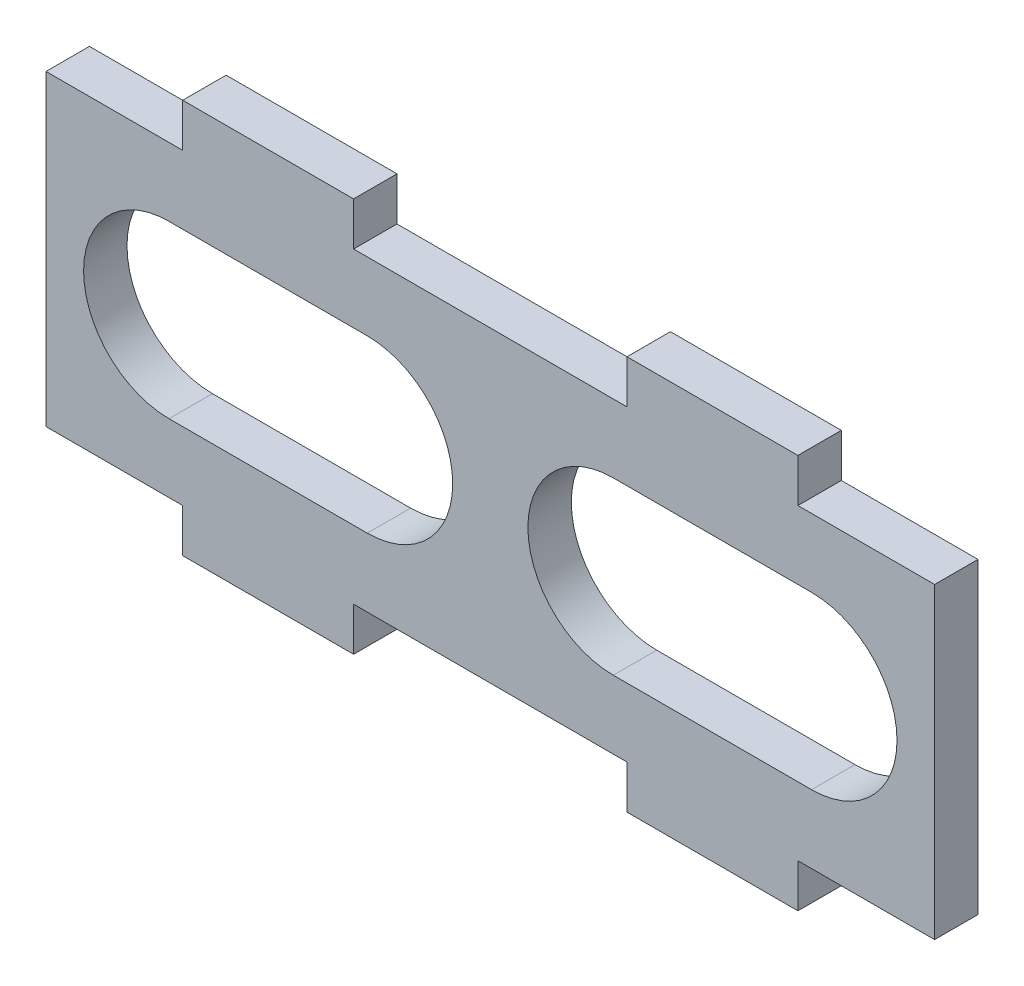
ISO-10303-21;
HEADER;
FILE_DESCRIPTION(('STEP AP214'),'2;1');
FILE_NAME('part.step','',(''),(''),'','','');
FILE_SCHEMA(('AUTOMOTIVE_DESIGN { 1 0 10303 214 1 1 1 1 }'));
ENDSEC;
DATA;
#1=APPLICATION_CONTEXT('core data for automotive mechanical design processes');
#2=APPLICATION_PROTOCOL_DEFINITION('international standard','automotive_design',2000,#1);
#3=PRODUCT_CONTEXT('',#1,'mechanical');
#4=PRODUCT('Part','Part','',(#3));
#5=PRODUCT_RELATED_PRODUCT_CATEGORY('part','',(#4));
#6=PRODUCT_DEFINITION_FORMATION('','',#4);
#7=PRODUCT_DEFINITION_CONTEXT('part definition',#1,'design');
#8=PRODUCT_DEFINITION('design','',#6,#7);
#9=PRODUCT_DEFINITION_SHAPE('','',#8);
#10=(LENGTH_UNIT() NAMED_UNIT(*) SI_UNIT(.MILLI.,.METRE.));
#11=(NAMED_UNIT(*) PLANE_ANGLE_UNIT() SI_UNIT($,.RADIAN.));
#12=(NAMED_UNIT(*) SI_UNIT($,.STERADIAN.) SOLID_ANGLE_UNIT());
#13=UNCERTAINTY_MEASURE_WITH_UNIT(LENGTH_MEASURE(1.E-05),#10,'distance_accuracy_value','');
#14=(GEOMETRIC_REPRESENTATION_CONTEXT(3) GLOBAL_UNCERTAINTY_ASSIGNED_CONTEXT((#13)) GLOBAL_UNIT_ASSIGNED_CONTEXT((#10,
#11,#12)) REPRESENTATION_CONTEXT('',''));
#15=CARTESIAN_POINT('',(0.,0.,0.));
#16=DIRECTION('',(0.,0.,1.));
#17=DIRECTION('',(1.,0.,0.));
#18=AXIS2_PLACEMENT_3D('',#15,#16,#17);
#19=CARTESIAN_POINT('',(-65.,0.,6.35));
#20=DIRECTION('',(0.,1.,0.));
#21=DIRECTION('',(0.,0.,1.));
#22=AXIS2_PLACEMENT_3D('',#19,#20,#21);
#23=PLANE('',#22);
#24=DIRECTION('',(1.,0.,0.));
#25=VECTOR('',#24,1.);
#26=CARTESIAN_POINT('',(-65.,0.,0.));
#27=LINE('',#26,#25);
#28=CARTESIAN_POINT('',(-20.,0.,0.));
#29=VERTEX_POINT('',#28);
#30=CARTESIAN_POINT('',(20.,0.,0.));
#31=VERTEX_POINT('',#30);
#32=EDGE_CURVE('E422',#29,#31,#27,.T.);
#33=ORIENTED_EDGE('',*,*,#32,.T.);
#34=DIRECTION('',(0.,0.,1.));
#35=VECTOR('',#34,1.);
#36=CARTESIAN_POINT('',(20.,0.,-25.7938461653163));
#37=LINE('',#36,#35);
#38=CARTESIAN_POINT('',(20.,0.,6.35));
#39=VERTEX_POINT('',#38);
#40=EDGE_CURVE('E55',#31,#39,#37,.T.);
#41=ORIENTED_EDGE('',*,*,#40,.T.);
#42=DIRECTION('',(1.,0.,0.));
#43=VECTOR('',#42,1.);
#44=CARTESIAN_POINT('',(-65.,0.,6.35));
#45=LINE('',#44,#43);
#46=CARTESIAN_POINT('',(-20.,0.,6.35));
#47=VERTEX_POINT('',#46);
#48=EDGE_CURVE('E407',#47,#39,#45,.T.);
#49=ORIENTED_EDGE('',*,*,#48,.F.);
#50=DIRECTION('',(0.,0.,1.));
#51=VECTOR('',#50,1.);
#52=CARTESIAN_POINT('',(-20.,0.,-25.7938461653163));
#53=LINE('',#52,#51);
#54=EDGE_CURVE('E302',#29,#47,#53,.T.);
#55=ORIENTED_EDGE('',*,*,#54,.F.);
#56=EDGE_LOOP('',(#33,#41,#49,#55));
#57=FACE_BOUND('',#56,.T.);
#58=ADVANCED_FACE('F32',(#57),#23,.F.);
#59=CARTESIAN_POINT('',(-65.,45.,6.35));
#60=DIRECTION('',(0.,-1.,0.));
#61=DIRECTION('',(1.,0.,0.));
#62=AXIS2_PLACEMENT_3D('',#59,#60,#61);
#63=PLANE('',#62);
#64=DIRECTION('',(-1.,0.,0.));
#65=VECTOR('',#64,1.);
#66=CARTESIAN_POINT('',(-65.,45.,6.35));
#67=LINE('',#66,#65);
#68=CARTESIAN_POINT('',(20.,45.,6.35));
#69=VERTEX_POINT('',#68);
#70=CARTESIAN_POINT('',(-20.,45.,6.35));
#71=VERTEX_POINT('',#70);
#72=EDGE_CURVE('E414',#69,#71,#67,.T.);
#73=ORIENTED_EDGE('',*,*,#72,.F.);
#74=DIRECTION('',(0.,0.,1.));
#75=VECTOR('',#74,1.);
#76=CARTESIAN_POINT('',(20.,45.,-25.7938461653163));
#77=LINE('',#76,#75);
#78=CARTESIAN_POINT('',(20.,45.,0.));
#79=VERTEX_POINT('',#78);
#80=EDGE_CURVE('E276',#79,#69,#77,.T.);
#81=ORIENTED_EDGE('',*,*,#80,.F.);
#82=DIRECTION('',(-1.,0.,0.));
#83=VECTOR('',#82,1.);
#84=CARTESIAN_POINT('',(-65.,45.,0.));
#85=LINE('',#84,#83);
#86=CARTESIAN_POINT('',(-20.,45.,0.));
#87=VERTEX_POINT('',#86);
#88=EDGE_CURVE('E426',#79,#87,#85,.T.);
#89=ORIENTED_EDGE('',*,*,#88,.T.);
#90=DIRECTION('',(0.,0.,1.));
#91=VECTOR('',#90,1.);
#92=CARTESIAN_POINT('',(-20.,45.,-25.7938461653163));
#93=LINE('',#92,#91);
#94=EDGE_CURVE('E312',#87,#71,#93,.T.);
#95=ORIENTED_EDGE('',*,*,#94,.T.);
#96=EDGE_LOOP('',(#73,#81,#89,#95));
#97=FACE_BOUND('',#96,.T.);
#98=ADVANCED_FACE('F459',(#97),#63,.F.);
#99=CARTESIAN_POINT('',(45.,0.,6.35));
#100=VERTEX_POINT('',#99);
#101=CARTESIAN_POINT('',(65.,0.,6.35));
#102=VERTEX_POINT('',#101);
#103=EDGE_CURVE('E47',#100,#102,#45,.T.);
#104=ORIENTED_EDGE('',*,*,#103,.F.);
#105=DIRECTION('',(0.,0.,1.));
#106=VECTOR('',#105,1.);
#107=CARTESIAN_POINT('',(45.,0.,-25.7938461653163));
#108=LINE('',#107,#106);
#109=CARTESIAN_POINT('',(45.,0.,0.));
#110=VERTEX_POINT('',#109);
#111=EDGE_CURVE('E250',#110,#100,#108,.T.);
#112=ORIENTED_EDGE('',*,*,#111,.F.);
#113=CARTESIAN_POINT('',(65.,0.,0.));
#114=VERTEX_POINT('',#113);
#115=EDGE_CURVE('E417',#110,#114,#27,.T.);
#116=ORIENTED_EDGE('',*,*,#115,.T.);
#117=DIRECTION('',(0.,0.,-1.));
#118=VECTOR('',#117,1.);
#119=CARTESIAN_POINT('',(65.,0.,6.35));
#120=LINE('',#119,#118);
#121=EDGE_CURVE('E40',#102,#114,#120,.T.);
#122=ORIENTED_EDGE('',*,*,#121,.F.);
#123=EDGE_LOOP('',(#104,#112,#116,#122));
#124=FACE_BOUND('',#123,.T.);
#125=ADVANCED_FACE('F489',(#124),#23,.F.);
#126=DIRECTION('',(0.,0.,1.));
#127=VECTOR('',#126,1.);
#128=CARTESIAN_POINT('',(-45.,45.,-25.7938461653163));
#129=LINE('',#128,#127);
#130=CARTESIAN_POINT('',(-45.,45.,0.));
#131=VERTEX_POINT('',#130);
#132=CARTESIAN_POINT('',(-45.,45.,6.35));
#133=VERTEX_POINT('',#132);
#134=EDGE_CURVE('E320',#131,#133,#129,.T.);
#135=ORIENTED_EDGE('',*,*,#134,.F.);
#136=CARTESIAN_POINT('',(-65.,45.,0.));
#137=VERTEX_POINT('',#136);
#138=EDGE_CURVE('E424',#131,#137,#85,.T.);
#139=ORIENTED_EDGE('',*,*,#138,.T.);
#140=DIRECTION('',(0.,0.,-1.));
#141=VECTOR('',#140,1.);
#142=CARTESIAN_POINT('',(-65.,45.,6.35));
#143=LINE('',#142,#141);
#144=CARTESIAN_POINT('',(-65.,45.,6.35));
#145=VERTEX_POINT('',#144);
#146=EDGE_CURVE('E413',#145,#137,#143,.T.);
#147=ORIENTED_EDGE('',*,*,#146,.F.);
#148=EDGE_CURVE('E409',#133,#145,#67,.T.);
#149=ORIENTED_EDGE('',*,*,#148,.F.);
#150=EDGE_LOOP('',(#135,#139,#147,#149));
#151=FACE_BOUND('',#150,.T.);
#152=ADVANCED_FACE('F469',(#151),#63,.F.);
#153=CARTESIAN_POINT('',(-65.,0.,6.35));
#154=DIRECTION('',(1.,0.,0.));
#155=DIRECTION('',(0.,0.,-1.));
#156=AXIS2_PLACEMENT_3D('',#153,#154,#155);
#157=PLANE('',#156);
#158=DIRECTION('',(0.,-1.,0.));
#159=VECTOR('',#158,1.);
#160=CARTESIAN_POINT('',(-65.,0.,0.));
#161=LINE('',#160,#159);
#162=CARTESIAN_POINT('',(-65.,0.,0.));
#163=VERTEX_POINT('',#162);
#164=EDGE_CURVE('E368',#137,#163,#161,.T.);
#165=ORIENTED_EDGE('',*,*,#164,.T.);
#166=DIRECTION('',(0.,0.,-1.));
#167=VECTOR('',#166,1.);
#168=CARTESIAN_POINT('',(-65.,0.,6.35));
#169=LINE('',#168,#167);
#170=CARTESIAN_POINT('',(-65.,0.,6.35));
#171=VERTEX_POINT('',#170);
#172=EDGE_CURVE('E11',#171,#163,#169,.T.);
#173=ORIENTED_EDGE('',*,*,#172,.F.);
#174=DIRECTION('',(0.,-1.,0.));
#175=VECTOR('',#174,1.);
#176=CARTESIAN_POINT('',(-65.,0.,6.35));
#177=LINE('',#176,#175);
#178=EDGE_CURVE('E399',#145,#171,#177,.T.);
#179=ORIENTED_EDGE('',*,*,#178,.F.);
#180=ORIENTED_EDGE('',*,*,#146,.T.);
#181=EDGE_LOOP('',(#165,#173,#179,#180));
#182=FACE_BOUND('',#181,.T.);
#183=ADVANCED_FACE('F34',(#182),#157,.F.);
#184=CARTESIAN_POINT('',(-45.,0.,0.));
#185=VERTEX_POINT('',#184);
#186=EDGE_CURVE('E418',#163,#185,#27,.T.);
#187=ORIENTED_EDGE('',*,*,#186,.T.);
#188=DIRECTION('',(0.,0.,1.));
#189=VECTOR('',#188,1.);
#190=CARTESIAN_POINT('',(-45.,0.,-25.7938461653163));
#191=LINE('',#190,#189);
#192=CARTESIAN_POINT('',(-45.,0.,6.35));
#193=VERTEX_POINT('',#192);
#194=EDGE_CURVE('E299',#185,#193,#191,.T.);
#195=ORIENTED_EDGE('',*,*,#194,.T.);
#196=EDGE_CURVE('E403',#171,#193,#45,.T.);
#197=ORIENTED_EDGE('',*,*,#196,.F.);
#198=ORIENTED_EDGE('',*,*,#172,.T.);
#199=EDGE_LOOP('',(#187,#195,#197,#198));
#200=FACE_BOUND('',#199,.T.);
#201=ADVANCED_FACE('F473',(#200),#23,.F.);
#202=CARTESIAN_POINT('',(65.,0.,6.35));
#203=DIRECTION('',(-1.,0.,0.));
#204=DIRECTION('',(0.,0.,1.));
#205=AXIS2_PLACEMENT_3D('',#202,#203,#204);
#206=PLANE('',#205);
#207=DIRECTION('',(0.,1.,0.));
#208=VECTOR('',#207,1.);
#209=CARTESIAN_POINT('',(65.,0.,0.));
#210=LINE('',#209,#208);
#211=CARTESIAN_POINT('',(65.,45.,0.));
#212=VERTEX_POINT('',#211);
#213=EDGE_CURVE('E421',#114,#212,#210,.T.);
#214=ORIENTED_EDGE('',*,*,#213,.T.);
#215=DIRECTION('',(0.,0.,-1.));
#216=VECTOR('',#215,1.);
#217=CARTESIAN_POINT('',(65.,45.,6.35));
#218=LINE('',#217,#216);
#219=CARTESIAN_POINT('',(65.,45.,6.35));
#220=VERTEX_POINT('',#219);
#221=EDGE_CURVE('E429',#220,#212,#218,.T.);
#222=ORIENTED_EDGE('',*,*,#221,.F.);
#223=DIRECTION('',(0.,1.,0.));
#224=VECTOR('',#223,1.);
#225=CARTESIAN_POINT('',(65.,0.,6.35));
#226=LINE('',#225,#224);
#227=EDGE_CURVE('E406',#102,#220,#226,.T.);
#228=ORIENTED_EDGE('',*,*,#227,.F.);
#229=ORIENTED_EDGE('',*,*,#121,.T.);
#230=EDGE_LOOP('',(#214,#222,#228,#229));
#231=FACE_BOUND('',#230,.T.);
#232=ADVANCED_FACE('F435',(#231),#206,.F.);
#233=CARTESIAN_POINT('',(45.,45.,0.));
#234=VERTEX_POINT('',#233);
#235=EDGE_CURVE('E402',#212,#234,#85,.T.);
#236=ORIENTED_EDGE('',*,*,#235,.T.);
#237=DIRECTION('',(0.,0.,1.));
#238=VECTOR('',#237,1.);
#239=CARTESIAN_POINT('',(45.,45.,-25.7938461653163));
#240=LINE('',#239,#238);
#241=CARTESIAN_POINT('',(45.,45.,6.35));
#242=VERTEX_POINT('',#241);
#243=EDGE_CURVE('E272',#234,#242,#240,.T.);
#244=ORIENTED_EDGE('',*,*,#243,.T.);
#245=EDGE_CURVE('E410',#220,#242,#67,.T.);
#246=ORIENTED_EDGE('',*,*,#245,.F.);
#247=ORIENTED_EDGE('',*,*,#221,.T.);
#248=EDGE_LOOP('',(#236,#244,#246,#247));
#249=FACE_BOUND('',#248,.T.);
#250=ADVANCED_FACE('F441',(#249),#63,.F.);
#251=CARTESIAN_POINT('',(0.,0.,6.35));
#252=DIRECTION('',(0.,0.,-1.));
#253=DIRECTION('',(-1.,0.,0.));
#254=AXIS2_PLACEMENT_3D('',#251,#252,#253);
#255=PLANE('',#254);
#256=DIRECTION('',(1.,0.,0.));
#257=VECTOR('',#256,1.);
#258=CARTESIAN_POINT('',(-47.,9.99999999999998,6.35));
#259=LINE('',#258,#257);
#260=CARTESIAN_POINT('',(-47.,9.99999999999998,6.35));
#261=VERTEX_POINT('',#260);
#262=CARTESIAN_POINT('',(-18.,10.,6.35));
#263=VERTEX_POINT('',#262);
#264=EDGE_CURVE('E347',#261,#263,#259,.T.);
#265=ORIENTED_EDGE('',*,*,#264,.F.);
#266=CARTESIAN_POINT('',(-47.,22.5,6.35));
#267=DIRECTION('',(0.,0.,1.));
#268=DIRECTION('',(1.,0.,0.));
#269=AXIS2_PLACEMENT_3D('',#266,#267,#268);
#270=CIRCLE('',#269,12.5);
#271=CARTESIAN_POINT('',(-47.,35.,6.35));
#272=VERTEX_POINT('',#271);
#273=EDGE_CURVE('E345',#272,#261,#270,.T.);
#274=ORIENTED_EDGE('',*,*,#273,.F.);
#275=DIRECTION('',(-1.,0.,0.));
#276=VECTOR('',#275,1.);
#277=CARTESIAN_POINT('',(-47.,35.,6.35));
#278=LINE('',#277,#276);
#279=CARTESIAN_POINT('',(-18.,35.,6.35));
#280=VERTEX_POINT('',#279);
#281=EDGE_CURVE('E353',#280,#272,#278,.T.);
#282=ORIENTED_EDGE('',*,*,#281,.F.);
#283=CARTESIAN_POINT('',(-18.,22.5,6.35));
#284=DIRECTION('',(0.,0.,1.));
#285=DIRECTION('',(1.,0.,0.));
#286=AXIS2_PLACEMENT_3D('',#283,#284,#285);
#287=CIRCLE('',#286,12.5);
#288=EDGE_CURVE('E350',#263,#280,#287,.T.);
#289=ORIENTED_EDGE('',*,*,#288,.F.);
#290=EDGE_LOOP('',(#265,#274,#282,#289));
#291=FACE_BOUND('',#290,.T.);
#292=DIRECTION('',(-1.,0.,0.));
#293=VECTOR('',#292,1.);
#294=CARTESIAN_POINT('',(47.,35.,6.35));
#295=LINE('',#294,#293);
#296=CARTESIAN_POINT('',(47.,35.,6.35));
#297=VERTEX_POINT('',#296);
#298=CARTESIAN_POINT('',(18.,35.,6.35));
#299=VERTEX_POINT('',#298);
#300=EDGE_CURVE('E379',#297,#299,#295,.T.);
#301=ORIENTED_EDGE('',*,*,#300,.F.);
#302=CARTESIAN_POINT('',(47.,22.5,6.35));
#303=DIRECTION('',(0.,0.,1.));
#304=DIRECTION('',(-1.,0.,0.));
#305=AXIS2_PLACEMENT_3D('',#302,#303,#304);
#306=CIRCLE('',#305,12.5);
#307=CARTESIAN_POINT('',(47.,9.99999999999999,6.35));
#308=VERTEX_POINT('',#307);
#309=EDGE_CURVE('E377',#308,#297,#306,.T.);
#310=ORIENTED_EDGE('',*,*,#309,.F.);
#311=DIRECTION('',(1.,0.,0.));
#312=VECTOR('',#311,1.);
#313=CARTESIAN_POINT('',(47.,9.99999999999999,6.35));
#314=LINE('',#313,#312);
#315=CARTESIAN_POINT('',(18.,10.,6.35));
#316=VERTEX_POINT('',#315);
#317=EDGE_CURVE('E385',#316,#308,#314,.T.);
#318=ORIENTED_EDGE('',*,*,#317,.F.);
#319=CARTESIAN_POINT('',(18.,22.5,6.35));
#320=DIRECTION('',(0.,0.,1.));
#321=DIRECTION('',(-1.,0.,0.));
#322=AXIS2_PLACEMENT_3D('',#319,#320,#321);
#323=CIRCLE('',#322,12.5);
#324=EDGE_CURVE('E382',#299,#316,#323,.T.);
#325=ORIENTED_EDGE('',*,*,#324,.F.);
#326=EDGE_LOOP('',(#301,#310,#318,#325));
#327=FACE_BOUND('',#326,.T.);
#328=ORIENTED_EDGE('',*,*,#178,.T.);
#329=ORIENTED_EDGE('',*,*,#196,.T.);
#330=DIRECTION('',(0.,-1.,0.));
#331=VECTOR('',#330,1.);
#332=CARTESIAN_POINT('',(-45.,0.,6.35));
#333=LINE('',#332,#331);
#334=CARTESIAN_POINT('',(-45.,-6.34999999999998,6.35));
#335=VERTEX_POINT('',#334);
#336=EDGE_CURVE('E282',#193,#335,#333,.T.);
#337=ORIENTED_EDGE('',*,*,#336,.T.);
#338=DIRECTION('',(1.,0.,0.));
#339=VECTOR('',#338,1.);
#340=CARTESIAN_POINT('',(-45.,-6.34999999999998,6.35));
#341=LINE('',#340,#339);
#342=CARTESIAN_POINT('',(-20.,-6.34999999999999,6.35));
#343=VERTEX_POINT('',#342);
#344=EDGE_CURVE('E287',#335,#343,#341,.T.);
#345=ORIENTED_EDGE('',*,*,#344,.T.);
#346=DIRECTION('',(0.,1.,0.));
#347=VECTOR('',#346,1.);
#348=CARTESIAN_POINT('',(-20.,0.,6.35));
#349=LINE('',#348,#347);
#350=EDGE_CURVE('E283',#343,#47,#349,.T.);
#351=ORIENTED_EDGE('',*,*,#350,.T.);
#352=ORIENTED_EDGE('',*,*,#48,.T.);
#353=DIRECTION('',(0.,-1.,0.));
#354=VECTOR('',#353,1.);
#355=CARTESIAN_POINT('',(20.,0.,6.35));
#356=LINE('',#355,#354);
#357=CARTESIAN_POINT('',(20.,-6.34999999999999,6.35));
#358=VERTEX_POINT('',#357);
#359=EDGE_CURVE('E248',#39,#358,#356,.T.);
#360=ORIENTED_EDGE('',*,*,#359,.T.);
#361=DIRECTION('',(1.,0.,0.));
#362=VECTOR('',#361,1.);
#363=CARTESIAN_POINT('',(45.,-6.34999999999998,6.35));
#364=LINE('',#363,#362);
#365=CARTESIAN_POINT('',(45.,-6.34999999999998,6.35));
#366=VERTEX_POINT('',#365);
#367=EDGE_CURVE('E236',#358,#366,#364,.T.);
#368=ORIENTED_EDGE('',*,*,#367,.T.);
#369=DIRECTION('',(0.,1.,0.));
#370=VECTOR('',#369,1.);
#371=CARTESIAN_POINT('',(45.,0.,6.35));
#372=LINE('',#371,#370);
#373=EDGE_CURVE('E242',#366,#100,#372,.T.);
#374=ORIENTED_EDGE('',*,*,#373,.T.);
#375=ORIENTED_EDGE('',*,*,#103,.T.);
#376=ORIENTED_EDGE('',*,*,#227,.T.);
#377=ORIENTED_EDGE('',*,*,#245,.T.);
#378=DIRECTION('',(0.,1.,0.));
#379=VECTOR('',#378,1.);
#380=CARTESIAN_POINT('',(45.,45.,6.35));
#381=LINE('',#380,#379);
#382=CARTESIAN_POINT('',(45.,51.35,6.35));
#383=VERTEX_POINT('',#382);
#384=EDGE_CURVE('E255',#242,#383,#381,.T.);
#385=ORIENTED_EDGE('',*,*,#384,.T.);
#386=DIRECTION('',(-1.,0.,0.));
#387=VECTOR('',#386,1.);
#388=CARTESIAN_POINT('',(45.,51.35,6.35));
#389=LINE('',#388,#387);
#390=CARTESIAN_POINT('',(20.,51.35,6.35));
#391=VERTEX_POINT('',#390);
#392=EDGE_CURVE('E260',#383,#391,#389,.T.);
#393=ORIENTED_EDGE('',*,*,#392,.T.);
#394=DIRECTION('',(0.,-1.,0.));
#395=VECTOR('',#394,1.);
#396=CARTESIAN_POINT('',(20.,45.,6.35));
#397=LINE('',#396,#395);
#398=EDGE_CURVE('E256',#391,#69,#397,.T.);
#399=ORIENTED_EDGE('',*,*,#398,.T.);
#400=ORIENTED_EDGE('',*,*,#72,.T.);
#401=DIRECTION('',(0.,1.,0.));
#402=VECTOR('',#401,1.);
#403=CARTESIAN_POINT('',(-20.,45.,6.35));
#404=LINE('',#403,#402);
#405=CARTESIAN_POINT('',(-20.,51.35,6.35));
#406=VERTEX_POINT('',#405);
#407=EDGE_CURVE('E313',#71,#406,#404,.T.);
#408=ORIENTED_EDGE('',*,*,#407,.T.);
#409=DIRECTION('',(-1.,0.,0.));
#410=VECTOR('',#409,1.);
#411=CARTESIAN_POINT('',(-45.,51.35,6.35));
#412=LINE('',#411,#410);
#413=CARTESIAN_POINT('',(-45.,51.35,6.35));
#414=VERTEX_POINT('',#413);
#415=EDGE_CURVE('E309',#406,#414,#412,.T.);
#416=ORIENTED_EDGE('',*,*,#415,.T.);
#417=DIRECTION('',(0.,-1.,0.));
#418=VECTOR('',#417,1.);
#419=CARTESIAN_POINT('',(-45.,45.,6.35));
#420=LINE('',#419,#418);
#421=EDGE_CURVE('E308',#414,#133,#420,.T.);
#422=ORIENTED_EDGE('',*,*,#421,.T.);
#423=ORIENTED_EDGE('',*,*,#148,.T.);
#424=EDGE_LOOP('',(#328,#329,#337,#345,#351,#352,#360,#368,#374,#375,#376,#377,#385,#393,#399,
#400,#408,#416,#422,#423));
#425=FACE_BOUND('',#424,.T.);
#426=ADVANCED_FACE('F445',(#291,#327,#425),#255,.F.);
#427=CARTESIAN_POINT('',(0.,0.,0.));
#428=DIRECTION('',(0.,0.,-1.));
#429=DIRECTION('',(-1.,0.,0.));
#430=AXIS2_PLACEMENT_3D('',#427,#428,#429);
#431=PLANE('',#430);
#432=CARTESIAN_POINT('',(-47.,22.5,0.));
#433=DIRECTION('',(0.,0.,-1.));
#434=DIRECTION('',(-1.,0.,0.));
#435=AXIS2_PLACEMENT_3D('',#432,#433,#434);
#436=CIRCLE('',#435,12.5);
#437=CARTESIAN_POINT('',(-47.,35.,0.));
#438=VERTEX_POINT('',#437);
#439=CARTESIAN_POINT('',(-47.,9.99999999999998,0.));
#440=VERTEX_POINT('',#439);
#441=EDGE_CURVE('E342',#438,#440,#436,.F.);
#442=ORIENTED_EDGE('',*,*,#441,.T.);
#443=DIRECTION('',(1.,0.,0.));
#444=VECTOR('',#443,1.);
#445=CARTESIAN_POINT('',(-47.,9.99999999999998,0.));
#446=LINE('',#445,#444);
#447=CARTESIAN_POINT('',(-18.,10.,0.));
#448=VERTEX_POINT('',#447);
#449=EDGE_CURVE('E359',#440,#448,#446,.T.);
#450=ORIENTED_EDGE('',*,*,#449,.T.);
#451=CARTESIAN_POINT('',(-18.,22.5,0.));
#452=DIRECTION('',(0.,0.,-1.));
#453=DIRECTION('',(-1.,0.,0.));
#454=AXIS2_PLACEMENT_3D('',#451,#452,#453);
#455=CIRCLE('',#454,12.5);
#456=CARTESIAN_POINT('',(-18.,35.,0.));
#457=VERTEX_POINT('',#456);
#458=EDGE_CURVE('E335',#448,#457,#455,.F.);
#459=ORIENTED_EDGE('',*,*,#458,.T.);
#460=DIRECTION('',(-1.,0.,0.));
#461=VECTOR('',#460,1.);
#462=CARTESIAN_POINT('',(-47.,35.,0.));
#463=LINE('',#462,#461);
#464=EDGE_CURVE('E338',#457,#438,#463,.T.);
#465=ORIENTED_EDGE('',*,*,#464,.T.);
#466=EDGE_LOOP('',(#442,#450,#459,#465));
#467=FACE_BOUND('',#466,.T.);
#468=CARTESIAN_POINT('',(47.,22.5,0.));
#469=DIRECTION('',(0.,0.,-1.));
#470=DIRECTION('',(-1.,0.,0.));
#471=AXIS2_PLACEMENT_3D('',#468,#469,#470);
#472=CIRCLE('',#471,12.5);
#473=CARTESIAN_POINT('',(47.,9.99999999999999,0.));
#474=VERTEX_POINT('',#473);
#475=CARTESIAN_POINT('',(47.,35.,0.));
#476=VERTEX_POINT('',#475);
#477=EDGE_CURVE('E374',#474,#476,#472,.F.);
#478=ORIENTED_EDGE('',*,*,#477,.T.);
#479=DIRECTION('',(-1.,0.,0.));
#480=VECTOR('',#479,1.);
#481=CARTESIAN_POINT('',(47.,35.,0.));
#482=LINE('',#481,#480);
#483=CARTESIAN_POINT('',(18.,35.,0.));
#484=VERTEX_POINT('',#483);
#485=EDGE_CURVE('E339',#476,#484,#482,.T.);
#486=ORIENTED_EDGE('',*,*,#485,.T.);
#487=CARTESIAN_POINT('',(18.,22.5,0.));
#488=DIRECTION('',(0.,0.,-1.));
#489=DIRECTION('',(-1.,0.,0.));
#490=AXIS2_PLACEMENT_3D('',#487,#488,#489);
#491=CIRCLE('',#490,12.5);
#492=CARTESIAN_POINT('',(18.,10.,0.));
#493=VERTEX_POINT('',#492);
#494=EDGE_CURVE('E334',#484,#493,#491,.F.);
#495=ORIENTED_EDGE('',*,*,#494,.T.);
#496=DIRECTION('',(1.,0.,0.));
#497=VECTOR('',#496,1.);
#498=CARTESIAN_POINT('',(47.,9.99999999999999,0.));
#499=LINE('',#498,#497);
#500=EDGE_CURVE('E371',#493,#474,#499,.T.);
#501=ORIENTED_EDGE('',*,*,#500,.T.);
#502=EDGE_LOOP('',(#478,#486,#495,#501));
#503=FACE_BOUND('',#502,.T.);
#504=ORIENTED_EDGE('',*,*,#164,.F.);
#505=ORIENTED_EDGE('',*,*,#138,.F.);
#506=DIRECTION('',(0.,-1.,0.));
#507=VECTOR('',#506,1.);
#508=CARTESIAN_POINT('',(-45.,45.,0.));
#509=LINE('',#508,#507);
#510=CARTESIAN_POINT('',(-45.,51.35,0.));
#511=VERTEX_POINT('',#510);
#512=EDGE_CURVE('E318',#511,#131,#509,.T.);
#513=ORIENTED_EDGE('',*,*,#512,.F.);
#514=DIRECTION('',(-1.,0.,0.));
#515=VECTOR('',#514,1.);
#516=CARTESIAN_POINT('',(-45.,51.35,0.));
#517=LINE('',#516,#515);
#518=CARTESIAN_POINT('',(-20.,51.35,0.));
#519=VERTEX_POINT('',#518);
#520=EDGE_CURVE('E322',#519,#511,#517,.T.);
#521=ORIENTED_EDGE('',*,*,#520,.F.);
#522=DIRECTION('',(0.,1.,0.));
#523=VECTOR('',#522,1.);
#524=CARTESIAN_POINT('',(-20.,45.,0.));
#525=LINE('',#524,#523);
#526=EDGE_CURVE('E326',#87,#519,#525,.T.);
#527=ORIENTED_EDGE('',*,*,#526,.F.);
#528=ORIENTED_EDGE('',*,*,#88,.F.);
#529=DIRECTION('',(0.,-1.,0.));
#530=VECTOR('',#529,1.);
#531=CARTESIAN_POINT('',(20.,45.,0.));
#532=LINE('',#531,#530);
#533=CARTESIAN_POINT('',(20.,51.35,0.));
#534=VERTEX_POINT('',#533);
#535=EDGE_CURVE('E273',#534,#79,#532,.T.);
#536=ORIENTED_EDGE('',*,*,#535,.F.);
#537=DIRECTION('',(-1.,0.,0.));
#538=VECTOR('',#537,1.);
#539=CARTESIAN_POINT('',(45.,51.35,0.));
#540=LINE('',#539,#538);
#541=CARTESIAN_POINT('',(45.,51.35,0.));
#542=VERTEX_POINT('',#541);
#543=EDGE_CURVE('E259',#542,#534,#540,.T.);
#544=ORIENTED_EDGE('',*,*,#543,.F.);
#545=DIRECTION('',(0.,1.,0.));
#546=VECTOR('',#545,1.);
#547=CARTESIAN_POINT('',(45.,45.,0.));
#548=LINE('',#547,#546);
#549=EDGE_CURVE('E268',#234,#542,#548,.T.);
#550=ORIENTED_EDGE('',*,*,#549,.F.);
#551=ORIENTED_EDGE('',*,*,#235,.F.);
#552=ORIENTED_EDGE('',*,*,#213,.F.);
#553=ORIENTED_EDGE('',*,*,#115,.F.);
#554=DIRECTION('',(0.,1.,0.));
#555=VECTOR('',#554,1.);
#556=CARTESIAN_POINT('',(45.,0.,0.));
#557=LINE('',#556,#555);
#558=CARTESIAN_POINT('',(45.,-6.34999999999998,0.));
#559=VERTEX_POINT('',#558);
#560=EDGE_CURVE('E227',#559,#110,#557,.T.);
#561=ORIENTED_EDGE('',*,*,#560,.F.);
#562=DIRECTION('',(1.,0.,0.));
#563=VECTOR('',#562,1.);
#564=CARTESIAN_POINT('',(45.,-6.34999999999998,0.));
#565=LINE('',#564,#563);
#566=CARTESIAN_POINT('',(20.,-6.34999999999999,0.));
#567=VERTEX_POINT('',#566);
#568=EDGE_CURVE('E219',#567,#559,#565,.T.);
#569=ORIENTED_EDGE('',*,*,#568,.F.);
#570=DIRECTION('',(0.,-1.,0.));
#571=VECTOR('',#570,1.);
#572=CARTESIAN_POINT('',(20.,0.,0.));
#573=LINE('',#572,#571);
#574=EDGE_CURVE('E225',#31,#567,#573,.T.);
#575=ORIENTED_EDGE('',*,*,#574,.F.);
#576=ORIENTED_EDGE('',*,*,#32,.F.);
#577=DIRECTION('',(0.,1.,0.));
#578=VECTOR('',#577,1.);
#579=CARTESIAN_POINT('',(-20.,0.,0.));
#580=LINE('',#579,#578);
#581=CARTESIAN_POINT('',(-20.,-6.34999999999999,0.));
#582=VERTEX_POINT('',#581);
#583=EDGE_CURVE('E300',#582,#29,#580,.T.);
#584=ORIENTED_EDGE('',*,*,#583,.F.);
#585=DIRECTION('',(1.,0.,0.));
#586=VECTOR('',#585,1.);
#587=CARTESIAN_POINT('',(-45.,-6.34999999999998,0.));
#588=LINE('',#587,#586);
#589=CARTESIAN_POINT('',(-45.,-6.34999999999998,0.));
#590=VERTEX_POINT('',#589);
#591=EDGE_CURVE('E286',#590,#582,#588,.T.);
#592=ORIENTED_EDGE('',*,*,#591,.F.);
#593=DIRECTION('',(0.,-1.,0.));
#594=VECTOR('',#593,1.);
#595=CARTESIAN_POINT('',(-45.,0.,0.));
#596=LINE('',#595,#594);
#597=EDGE_CURVE('E295',#185,#590,#596,.T.);
#598=ORIENTED_EDGE('',*,*,#597,.F.);
#599=ORIENTED_EDGE('',*,*,#186,.F.);
#600=EDGE_LOOP('',(#504,#505,#513,#521,#527,#528,#536,#544,#550,#551,#552,#553,#561,#569,#575,
#576,#584,#592,#598,#599));
#601=FACE_BOUND('',#600,.T.);
#602=ADVANCED_FACE('F222',(#467,#503,#601),#431,.T.);
#603=CARTESIAN_POINT('',(47.,22.5,-0.00100000000000013));
#604=DIRECTION('',(0.,0.,1.));
#605=DIRECTION('',(1.,0.,0.));
#606=AXIS2_PLACEMENT_3D('',#603,#604,#605);
#607=CYLINDRICAL_SURFACE('',#606,12.5);
#608=DIRECTION('',(0.,0.,1.));
#609=VECTOR('',#608,1.);
#610=CARTESIAN_POINT('',(47.,9.99999999999999,-0.00100000000000013));
#611=LINE('',#610,#609);
#612=EDGE_CURVE('E389',#474,#308,#611,.T.);
#613=ORIENTED_EDGE('',*,*,#612,.T.);
#614=ORIENTED_EDGE('',*,*,#309,.T.);
#615=DIRECTION('',(0.,0.,1.));
#616=VECTOR('',#615,1.);
#617=CARTESIAN_POINT('',(47.,35.,-0.00100000000000013));
#618=LINE('',#617,#616);
#619=EDGE_CURVE('E388',#476,#297,#618,.T.);
#620=ORIENTED_EDGE('',*,*,#619,.F.);
#621=ORIENTED_EDGE('',*,*,#477,.F.);
#622=EDGE_LOOP('',(#613,#614,#620,#621));
#623=FACE_BOUND('',#622,.T.);
#624=ADVANCED_FACE('F538',(#623),#607,.F.);
#625=CARTESIAN_POINT('',(47.,9.99999999999999,-0.00100000000000013));
#626=DIRECTION('',(0.,-1.,0.));
#627=DIRECTION('',(1.,0.,0.));
#628=AXIS2_PLACEMENT_3D('',#625,#626,#627);
#629=PLANE('',#628);
#630=DIRECTION('',(0.,0.,1.));
#631=VECTOR('',#630,1.);
#632=CARTESIAN_POINT('',(18.,10.,-0.00100000000000013));
#633=LINE('',#632,#631);
#634=EDGE_CURVE('E391',#493,#316,#633,.T.);
#635=ORIENTED_EDGE('',*,*,#634,.T.);
#636=ORIENTED_EDGE('',*,*,#317,.T.);
#637=ORIENTED_EDGE('',*,*,#612,.F.);
#638=ORIENTED_EDGE('',*,*,#500,.F.);
#639=EDGE_LOOP('',(#635,#636,#637,#638));
#640=FACE_BOUND('',#639,.T.);
#641=ADVANCED_FACE('F545',(#640),#629,.F.);
#642=CARTESIAN_POINT('',(18.,22.5,-0.00100000000000013));
#643=DIRECTION('',(0.,0.,1.));
#644=DIRECTION('',(1.,0.,0.));
#645=AXIS2_PLACEMENT_3D('',#642,#643,#644);
#646=CYLINDRICAL_SURFACE('',#645,12.5);
#647=DIRECTION('',(0.,0.,1.));
#648=VECTOR('',#647,1.);
#649=CARTESIAN_POINT('',(18.,35.,-0.00100000000000013));
#650=LINE('',#649,#648);
#651=EDGE_CURVE('E393',#484,#299,#650,.T.);
#652=ORIENTED_EDGE('',*,*,#651,.T.);
#653=ORIENTED_EDGE('',*,*,#324,.T.);
#654=ORIENTED_EDGE('',*,*,#634,.F.);
#655=ORIENTED_EDGE('',*,*,#494,.F.);
#656=EDGE_LOOP('',(#652,#653,#654,#655));
#657=FACE_BOUND('',#656,.T.);
#658=ADVANCED_FACE('F551',(#657),#646,.F.);
#659=CARTESIAN_POINT('',(47.,35.,-0.00100000000000013));
#660=DIRECTION('',(0.,1.,0.));
#661=DIRECTION('',(-1.,0.,0.));
#662=AXIS2_PLACEMENT_3D('',#659,#660,#661);
#663=PLANE('',#662);
#664=ORIENTED_EDGE('',*,*,#619,.T.);
#665=ORIENTED_EDGE('',*,*,#300,.T.);
#666=ORIENTED_EDGE('',*,*,#651,.F.);
#667=ORIENTED_EDGE('',*,*,#485,.F.);
#668=EDGE_LOOP('',(#664,#665,#666,#667));
#669=FACE_BOUND('',#668,.T.);
#670=ADVANCED_FACE('F547',(#669),#663,.F.);
#671=CARTESIAN_POINT('',(-47.,22.5,-0.00100000000000013));
#672=DIRECTION('',(0.,0.,1.));
#673=DIRECTION('',(1.,0.,0.));
#674=AXIS2_PLACEMENT_3D('',#671,#672,#673);
#675=CYLINDRICAL_SURFACE('',#674,12.5);
#676=DIRECTION('',(0.,0.,1.));
#677=VECTOR('',#676,1.);
#678=CARTESIAN_POINT('',(-47.,35.,-0.00100000000000013));
#679=LINE('',#678,#677);
#680=EDGE_CURVE('E357',#438,#272,#679,.T.);
#681=ORIENTED_EDGE('',*,*,#680,.T.);
#682=ORIENTED_EDGE('',*,*,#273,.T.);
#683=DIRECTION('',(0.,0.,1.));
#684=VECTOR('',#683,1.);
#685=CARTESIAN_POINT('',(-47.,9.99999999999998,-0.00100000000000013));
#686=LINE('',#685,#684);
#687=EDGE_CURVE('E356',#440,#261,#686,.T.);
#688=ORIENTED_EDGE('',*,*,#687,.F.);
#689=ORIENTED_EDGE('',*,*,#441,.F.);
#690=EDGE_LOOP('',(#681,#682,#688,#689));
#691=FACE_BOUND('',#690,.T.);
#692=ADVANCED_FACE('F550',(#691),#675,.F.);
#693=CARTESIAN_POINT('',(-47.,35.,-0.00100000000000013));
#694=DIRECTION('',(0.,1.,0.));
#695=DIRECTION('',(-1.,0.,0.));
#696=AXIS2_PLACEMENT_3D('',#693,#694,#695);
#697=PLANE('',#696);
#698=DIRECTION('',(0.,0.,1.));
#699=VECTOR('',#698,1.);
#700=CARTESIAN_POINT('',(-18.,35.,-0.00100000000000013));
#701=LINE('',#700,#699);
#702=EDGE_CURVE('E360',#457,#280,#701,.T.);
#703=ORIENTED_EDGE('',*,*,#702,.T.);
#704=ORIENTED_EDGE('',*,*,#281,.T.);
#705=ORIENTED_EDGE('',*,*,#680,.F.);
#706=ORIENTED_EDGE('',*,*,#464,.F.);
#707=EDGE_LOOP('',(#703,#704,#705,#706));
#708=FACE_BOUND('',#707,.T.);
#709=ADVANCED_FACE('F560',(#708),#697,.F.);
#710=CARTESIAN_POINT('',(-18.,22.5,-0.00100000000000013));
#711=DIRECTION('',(0.,0.,1.));
#712=DIRECTION('',(1.,0.,0.));
#713=AXIS2_PLACEMENT_3D('',#710,#711,#712);
#714=CYLINDRICAL_SURFACE('',#713,12.5);
#715=DIRECTION('',(0.,0.,1.));
#716=VECTOR('',#715,1.);
#717=CARTESIAN_POINT('',(-18.,10.,-0.00100000000000013));
#718=LINE('',#717,#716);
#719=EDGE_CURVE('E362',#448,#263,#718,.T.);
#720=ORIENTED_EDGE('',*,*,#719,.T.);
#721=ORIENTED_EDGE('',*,*,#288,.T.);
#722=ORIENTED_EDGE('',*,*,#702,.F.);
#723=ORIENTED_EDGE('',*,*,#458,.F.);
#724=EDGE_LOOP('',(#720,#721,#722,#723));
#725=FACE_BOUND('',#724,.T.);
#726=ADVANCED_FACE('F507',(#725),#714,.F.);
#727=CARTESIAN_POINT('',(-47.,9.99999999999998,-0.00100000000000013));
#728=DIRECTION('',(0.,-1.,0.));
#729=DIRECTION('',(1.,0.,0.));
#730=AXIS2_PLACEMENT_3D('',#727,#728,#729);
#731=PLANE('',#730);
#732=ORIENTED_EDGE('',*,*,#687,.T.);
#733=ORIENTED_EDGE('',*,*,#264,.T.);
#734=ORIENTED_EDGE('',*,*,#719,.F.);
#735=ORIENTED_EDGE('',*,*,#449,.F.);
#736=EDGE_LOOP('',(#732,#733,#734,#735));
#737=FACE_BOUND('',#736,.T.);
#738=ADVANCED_FACE('F500',(#737),#731,.F.);
#739=CARTESIAN_POINT('',(-20.,45.,-25.7938461653163));
#740=DIRECTION('',(1.,0.,0.));
#741=DIRECTION('',(0.,1.,0.));
#742=AXIS2_PLACEMENT_3D('',#739,#740,#741);
#743=PLANE('',#742);
#744=ORIENTED_EDGE('',*,*,#94,.F.);
#745=ORIENTED_EDGE('',*,*,#526,.T.);
#746=DIRECTION('',(0.,0.,1.));
#747=VECTOR('',#746,1.);
#748=CARTESIAN_POINT('',(-20.,51.35,-25.7938461653163));
#749=LINE('',#748,#747);
#750=EDGE_CURVE('E325',#519,#406,#749,.T.);
#751=ORIENTED_EDGE('',*,*,#750,.T.);
#752=ORIENTED_EDGE('',*,*,#407,.F.);
#753=EDGE_LOOP('',(#744,#745,#751,#752));
#754=FACE_BOUND('',#753,.T.);
#755=ADVANCED_FACE('F498',(#754),#743,.T.);
#756=CARTESIAN_POINT('',(-45.,51.35,-25.7938461653163));
#757=DIRECTION('',(0.,1.,0.));
#758=DIRECTION('',(-1.,0.,0.));
#759=AXIS2_PLACEMENT_3D('',#756,#757,#758);
#760=PLANE('',#759);
#761=ORIENTED_EDGE('',*,*,#750,.F.);
#762=ORIENTED_EDGE('',*,*,#520,.T.);
#763=DIRECTION('',(0.,0.,1.));
#764=VECTOR('',#763,1.);
#765=CARTESIAN_POINT('',(-45.,51.35,-25.7938461653163));
#766=LINE('',#765,#764);
#767=EDGE_CURVE('E321',#511,#414,#766,.T.);
#768=ORIENTED_EDGE('',*,*,#767,.T.);
#769=ORIENTED_EDGE('',*,*,#415,.F.);
#770=EDGE_LOOP('',(#761,#762,#768,#769));
#771=FACE_BOUND('',#770,.T.);
#772=ADVANCED_FACE('F496',(#771),#760,.T.);
#773=CARTESIAN_POINT('',(-45.,45.,-25.7938461653163));
#774=DIRECTION('',(-1.,0.,0.));
#775=DIRECTION('',(0.,0.,1.));
#776=AXIS2_PLACEMENT_3D('',#773,#774,#775);
#777=PLANE('',#776);
#778=ORIENTED_EDGE('',*,*,#767,.F.);
#779=ORIENTED_EDGE('',*,*,#512,.T.);
#780=ORIENTED_EDGE('',*,*,#134,.T.);
#781=ORIENTED_EDGE('',*,*,#421,.F.);
#782=EDGE_LOOP('',(#778,#779,#780,#781));
#783=FACE_BOUND('',#782,.T.);
#784=ADVANCED_FACE('F493',(#783),#777,.T.);
#785=CARTESIAN_POINT('',(-45.,-6.34999999999998,-25.7938461653163));
#786=DIRECTION('',(0.,-1.,0.));
#787=DIRECTION('',(1.,0.,0.));
#788=AXIS2_PLACEMENT_3D('',#785,#786,#787);
#789=PLANE('',#788);
#790=DIRECTION('',(0.,0.,1.));
#791=VECTOR('',#790,1.);
#792=CARTESIAN_POINT('',(-45.,-6.34999999999998,-25.7938461653163));
#793=LINE('',#792,#791);
#794=EDGE_CURVE('E298',#590,#335,#793,.T.);
#795=ORIENTED_EDGE('',*,*,#794,.F.);
#796=ORIENTED_EDGE('',*,*,#591,.T.);
#797=DIRECTION('',(0.,0.,1.));
#798=VECTOR('',#797,1.);
#799=CARTESIAN_POINT('',(-20.,-6.34999999999999,-25.7938461653163));
#800=LINE('',#799,#798);
#801=EDGE_CURVE('E294',#582,#343,#800,.T.);
#802=ORIENTED_EDGE('',*,*,#801,.T.);
#803=ORIENTED_EDGE('',*,*,#344,.F.);
#804=EDGE_LOOP('',(#795,#796,#802,#803));
#805=FACE_BOUND('',#804,.T.);
#806=ADVANCED_FACE('F480',(#805),#789,.T.);
#807=CARTESIAN_POINT('',(-20.,0.,-25.7938461653163));
#808=DIRECTION('',(1.,0.,0.));
#809=DIRECTION('',(0.,1.,0.));
#810=AXIS2_PLACEMENT_3D('',#807,#808,#809);
#811=PLANE('',#810);
#812=ORIENTED_EDGE('',*,*,#801,.F.);
#813=ORIENTED_EDGE('',*,*,#583,.T.);
#814=ORIENTED_EDGE('',*,*,#54,.T.);
#815=ORIENTED_EDGE('',*,*,#350,.F.);
#816=EDGE_LOOP('',(#812,#813,#814,#815));
#817=FACE_BOUND('',#816,.T.);
#818=ADVANCED_FACE('F484',(#817),#811,.T.);
#819=CARTESIAN_POINT('',(-45.,0.,-25.7938461653163));
#820=DIRECTION('',(-1.,0.,0.));
#821=DIRECTION('',(0.,0.,1.));
#822=AXIS2_PLACEMENT_3D('',#819,#820,#821);
#823=PLANE('',#822);
#824=ORIENTED_EDGE('',*,*,#194,.F.);
#825=ORIENTED_EDGE('',*,*,#597,.T.);
#826=ORIENTED_EDGE('',*,*,#794,.T.);
#827=ORIENTED_EDGE('',*,*,#336,.F.);
#828=EDGE_LOOP('',(#824,#825,#826,#827));
#829=FACE_BOUND('',#828,.T.);
#830=ADVANCED_FACE('F477',(#829),#823,.T.);
#831=CARTESIAN_POINT('',(45.,51.35,-25.7938461653163));
#832=DIRECTION('',(0.,1.,0.));
#833=DIRECTION('',(-1.,0.,0.));
#834=AXIS2_PLACEMENT_3D('',#831,#832,#833);
#835=PLANE('',#834);
#836=DIRECTION('',(0.,0.,1.));
#837=VECTOR('',#836,1.);
#838=CARTESIAN_POINT('',(45.,51.35,-25.7938461653163));
#839=LINE('',#838,#837);
#840=EDGE_CURVE('E271',#542,#383,#839,.T.);
#841=ORIENTED_EDGE('',*,*,#840,.F.);
#842=ORIENTED_EDGE('',*,*,#543,.T.);
#843=DIRECTION('',(0.,0.,1.));
#844=VECTOR('',#843,1.);
#845=CARTESIAN_POINT('',(20.,51.35,-25.7938461653163));
#846=LINE('',#845,#844);
#847=EDGE_CURVE('E267',#534,#391,#846,.T.);
#848=ORIENTED_EDGE('',*,*,#847,.T.);
#849=ORIENTED_EDGE('',*,*,#392,.F.);
#850=EDGE_LOOP('',(#841,#842,#848,#849));
#851=FACE_BOUND('',#850,.T.);
#852=ADVANCED_FACE('F451',(#851),#835,.T.);
#853=CARTESIAN_POINT('',(20.,45.,-25.7938461653163));
#854=DIRECTION('',(-1.,0.,0.));
#855=DIRECTION('',(0.,-1.,0.));
#856=AXIS2_PLACEMENT_3D('',#853,#854,#855);
#857=PLANE('',#856);
#858=ORIENTED_EDGE('',*,*,#847,.F.);
#859=ORIENTED_EDGE('',*,*,#535,.T.);
#860=ORIENTED_EDGE('',*,*,#80,.T.);
#861=ORIENTED_EDGE('',*,*,#398,.F.);
#862=EDGE_LOOP('',(#858,#859,#860,#861));
#863=FACE_BOUND('',#862,.T.);
#864=ADVANCED_FACE('F456',(#863),#857,.T.);
#865=CARTESIAN_POINT('',(45.,45.,-25.7938461653163));
#866=DIRECTION('',(1.,0.,0.));
#867=DIRECTION('',(0.,0.,-1.));
#868=AXIS2_PLACEMENT_3D('',#865,#866,#867);
#869=PLANE('',#868);
#870=ORIENTED_EDGE('',*,*,#243,.F.);
#871=ORIENTED_EDGE('',*,*,#549,.T.);
#872=ORIENTED_EDGE('',*,*,#840,.T.);
#873=ORIENTED_EDGE('',*,*,#384,.F.);
#874=EDGE_LOOP('',(#870,#871,#872,#873));
#875=FACE_BOUND('',#874,.T.);
#876=ADVANCED_FACE('F447',(#875),#869,.T.);
#877=CARTESIAN_POINT('',(20.,0.,-25.7938461653163));
#878=DIRECTION('',(-1.,0.,0.));
#879=DIRECTION('',(0.,-1.,0.));
#880=AXIS2_PLACEMENT_3D('',#877,#878,#879);
#881=PLANE('',#880);
#882=ORIENTED_EDGE('',*,*,#40,.F.);
#883=ORIENTED_EDGE('',*,*,#574,.T.);
#884=DIRECTION('',(0.,0.,1.));
#885=VECTOR('',#884,1.);
#886=CARTESIAN_POINT('',(20.,-6.34999999999999,-25.7938461653163));
#887=LINE('',#886,#885);
#888=EDGE_CURVE('E231',#567,#358,#887,.T.);
#889=ORIENTED_EDGE('',*,*,#888,.T.);
#890=ORIENTED_EDGE('',*,*,#359,.F.);
#891=EDGE_LOOP('',(#882,#883,#889,#890));
#892=FACE_BOUND('',#891,.T.);
#893=ADVANCED_FACE('F241',(#892),#881,.T.);
#894=CARTESIAN_POINT('',(45.,-6.34999999999998,-25.7938461653163));
#895=DIRECTION('',(0.,-1.,0.));
#896=DIRECTION('',(1.,0.,0.));
#897=AXIS2_PLACEMENT_3D('',#894,#895,#896);
#898=PLANE('',#897);
#899=ORIENTED_EDGE('',*,*,#888,.F.);
#900=ORIENTED_EDGE('',*,*,#568,.T.);
#901=DIRECTION('',(0.,0.,1.));
#902=VECTOR('',#901,1.);
#903=CARTESIAN_POINT('',(45.,-6.34999999999998,-25.7938461653163));
#904=LINE('',#903,#902);
#905=EDGE_CURVE('E230',#559,#366,#904,.T.);
#906=ORIENTED_EDGE('',*,*,#905,.T.);
#907=ORIENTED_EDGE('',*,*,#367,.F.);
#908=EDGE_LOOP('',(#899,#900,#906,#907));
#909=FACE_BOUND('',#908,.T.);
#910=ADVANCED_FACE('F234',(#909),#898,.T.);
#911=CARTESIAN_POINT('',(45.,0.,-25.7938461653163));
#912=DIRECTION('',(1.,0.,0.));
#913=DIRECTION('',(0.,0.,-1.));
#914=AXIS2_PLACEMENT_3D('',#911,#912,#913);
#915=PLANE('',#914);
#916=ORIENTED_EDGE('',*,*,#905,.F.);
#917=ORIENTED_EDGE('',*,*,#560,.T.);
#918=ORIENTED_EDGE('',*,*,#111,.T.);
#919=ORIENTED_EDGE('',*,*,#373,.F.);
#920=EDGE_LOOP('',(#916,#917,#918,#919));
#921=FACE_BOUND('',#920,.T.);
#922=ADVANCED_FACE('F488',(#921),#915,.T.);
#923=CLOSED_SHELL('',(#58,#98,#125,#152,#183,#201,#232,#250,#426,#602,#624,#641,#658,#670,#692,
#709,#726,#738,#755,#772,#784,#806,#818,#830,#852,#864,#876,#893,#910,#922));
#924=MANIFOLD_SOLID_BREP('B2',#923);
#925=ADVANCED_BREP_SHAPE_REPRESENTATION('',(#18,#924),#14);
#926=SHAPE_DEFINITION_REPRESENTATION(#9,#925);
ENDSEC;
END-ISO-10303-21;
